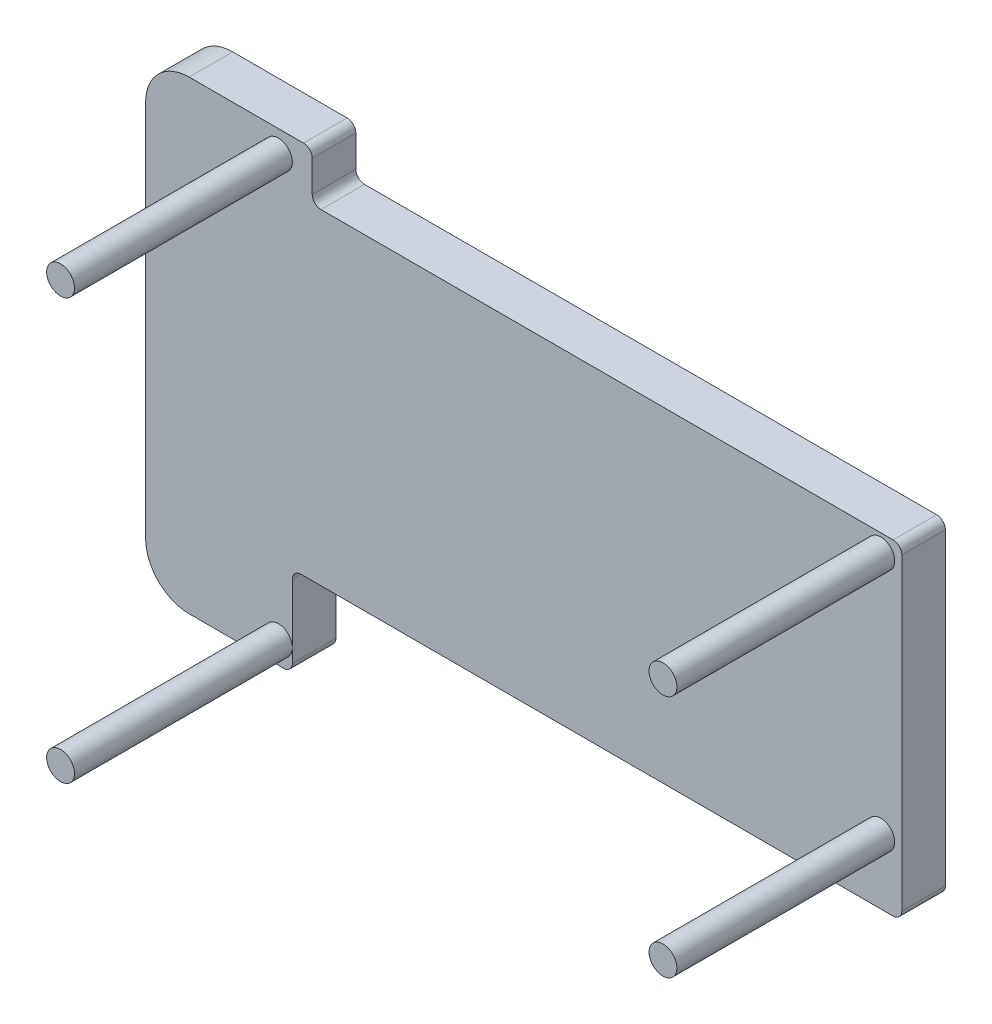
ISO-10303-21;
HEADER;
FILE_DESCRIPTION(('STEP AP214'),'2;1');
FILE_NAME('part.step','',(''),(''),'','','');
FILE_SCHEMA(('AUTOMOTIVE_DESIGN { 1 0 10303 214 1 1 1 1 }'));
ENDSEC;
DATA;
#1=APPLICATION_CONTEXT('core data for automotive mechanical design processes');
#2=APPLICATION_PROTOCOL_DEFINITION('international standard','automotive_design',2000,#1);
#3=PRODUCT_CONTEXT('',#1,'mechanical');
#4=PRODUCT('Part','Part','',(#3));
#5=PRODUCT_RELATED_PRODUCT_CATEGORY('part','',(#4));
#6=PRODUCT_DEFINITION_FORMATION('','',#4);
#7=PRODUCT_DEFINITION_CONTEXT('part definition',#1,'design');
#8=PRODUCT_DEFINITION('design','',#6,#7);
#9=PRODUCT_DEFINITION_SHAPE('','',#8);
#10=(LENGTH_UNIT() NAMED_UNIT(*) SI_UNIT(.MILLI.,.METRE.));
#11=(NAMED_UNIT(*) PLANE_ANGLE_UNIT() SI_UNIT($,.RADIAN.));
#12=(NAMED_UNIT(*) SI_UNIT($,.STERADIAN.) SOLID_ANGLE_UNIT());
#13=UNCERTAINTY_MEASURE_WITH_UNIT(LENGTH_MEASURE(1.E-05),#10,'distance_accuracy_value','');
#14=(GEOMETRIC_REPRESENTATION_CONTEXT(3) GLOBAL_UNCERTAINTY_ASSIGNED_CONTEXT((#13)) GLOBAL_UNIT_ASSIGNED_CONTEXT((#10,
#11,#12)) REPRESENTATION_CONTEXT('',''));
#15=CARTESIAN_POINT('',(0.,0.,0.));
#16=DIRECTION('',(0.,0.,1.));
#17=DIRECTION('',(1.,0.,0.));
#18=AXIS2_PLACEMENT_3D('',#15,#16,#17);
#19=CARTESIAN_POINT('',(-28.1477129898509,-24.13,25.));
#20=DIRECTION('',(0.,0.,-1.));
#21=DIRECTION('',(-1.,0.,0.));
#22=AXIS2_PLACEMENT_3D('',#19,#20,#21);
#23=CYLINDRICAL_SURFACE('',#22,1.6);
#24=CARTESIAN_POINT('',(-28.1477129898509,-24.13,25.));
#25=DIRECTION('',(0.,0.,1.));
#26=DIRECTION('',(1.,0.,0.));
#27=AXIS2_PLACEMENT_3D('',#24,#25,#26);
#28=CIRCLE('',#27,1.6);
#29=CARTESIAN_POINT('',(-26.5477129898509,-24.13,25.));
#30=VERTEX_POINT('',#29);
#31=EDGE_CURVE('E257',#30,#30,#28,.T.);
#32=ORIENTED_EDGE('',*,*,#31,.F.);
#33=EDGE_LOOP('',(#32));
#34=FACE_BOUND('',#33,.T.);
#35=CARTESIAN_POINT('',(-28.1477129898509,-24.13,0.));
#36=DIRECTION('',(0.,0.,1.));
#37=DIRECTION('',(1.,0.,0.));
#38=AXIS2_PLACEMENT_3D('',#35,#36,#37);
#39=CIRCLE('',#38,1.6);
#40=CARTESIAN_POINT('',(-26.5477129898509,-24.13,0.));
#41=VERTEX_POINT('',#40);
#42=EDGE_CURVE('E228',#41,#41,#39,.T.);
#43=ORIENTED_EDGE('',*,*,#42,.T.);
#44=EDGE_LOOP('',(#43));
#45=FACE_BOUND('',#44,.T.);
#46=ADVANCED_FACE('F35',(#34,#45),#23,.T.);
#47=CARTESIAN_POINT('',(-28.1477129898509,-24.13,25.));
#48=DIRECTION('',(0.,0.,1.));
#49=DIRECTION('',(1.,0.,0.));
#50=AXIS2_PLACEMENT_3D('',#47,#48,#49);
#51=PLANE('',#50);
#52=ORIENTED_EDGE('',*,*,#31,.T.);
#53=EDGE_LOOP('',(#52));
#54=FACE_BOUND('',#53,.T.);
#55=ADVANCED_FACE('F366',(#54),#51,.T.);
#56=CARTESIAN_POINT('',(-25.5477129898509,-17.3186177986598,-5.));
#57=DIRECTION('',(0.,0.,1.));
#58=DIRECTION('',(1.,0.,0.));
#59=AXIS2_PLACEMENT_3D('',#56,#57,#58);
#60=CYLINDRICAL_SURFACE('',#59,1.);
#61=CARTESIAN_POINT('',(-25.5477129898509,-17.3186177986598,0.));
#62=DIRECTION('',(0.,0.,-1.));
#63=DIRECTION('',(-1.,0.,0.));
#64=AXIS2_PLACEMENT_3D('',#61,#62,#63);
#65=CIRCLE('',#64,1.);
#66=CARTESIAN_POINT('',(-26.5477129898509,-17.3186177986598,0.));
#67=VERTEX_POINT('',#66);
#68=CARTESIAN_POINT('',(-25.5477129898509,-16.3186177986598,0.));
#69=VERTEX_POINT('',#68);
#70=EDGE_CURVE('E185',#67,#69,#65,.T.);
#71=ORIENTED_EDGE('',*,*,#70,.F.);
#72=DIRECTION('',(0.,0.,1.));
#73=VECTOR('',#72,1.);
#74=CARTESIAN_POINT('',(-26.5477129898509,-17.3186177986598,-5.));
#75=LINE('',#74,#73);
#76=CARTESIAN_POINT('',(-26.5477129898509,-17.3186177986598,-5.));
#77=VERTEX_POINT('',#76);
#78=EDGE_CURVE('E226',#77,#67,#75,.T.);
#79=ORIENTED_EDGE('',*,*,#78,.F.);
#80=CARTESIAN_POINT('',(-25.5477129898509,-17.3186177986598,-5.));
#81=DIRECTION('',(0.,0.,-1.));
#82=DIRECTION('',(-1.,0.,0.));
#83=AXIS2_PLACEMENT_3D('',#80,#81,#82);
#84=CIRCLE('',#83,1.);
#85=CARTESIAN_POINT('',(-25.5477129898509,-16.3186177986598,-5.));
#86=VERTEX_POINT('',#85);
#87=EDGE_CURVE('E225',#77,#86,#84,.T.);
#88=ORIENTED_EDGE('',*,*,#87,.T.);
#89=DIRECTION('',(0.,0.,1.));
#90=VECTOR('',#89,1.);
#91=CARTESIAN_POINT('',(-25.5477129898509,-16.3186177986598,-5.));
#92=LINE('',#91,#90);
#93=EDGE_CURVE('E118',#86,#69,#92,.T.);
#94=ORIENTED_EDGE('',*,*,#93,.T.);
#95=EDGE_LOOP('',(#71,#79,#88,#94));
#96=FACE_BOUND('',#95,.T.);
#97=ADVANCED_FACE('F362',(#96),#60,.F.);
#98=CARTESIAN_POINT('',(-26.5477129898509,-24.13,-5.));
#99=DIRECTION('',(1.,0.,0.));
#100=DIRECTION('',(0.,1.,0.));
#101=AXIS2_PLACEMENT_3D('',#98,#99,#100);
#102=PLANE('',#101);
#103=DIRECTION('',(0.,1.,0.));
#104=VECTOR('',#103,1.);
#105=CARTESIAN_POINT('',(-26.5477129898509,-24.13,0.));
#106=LINE('',#105,#104);
#107=CARTESIAN_POINT('',(-26.5477129898509,-25.67,0.));
#108=VERTEX_POINT('',#107);
#109=EDGE_CURVE('E49',#108,#41,#106,.T.);
#110=ORIENTED_EDGE('',*,*,#109,.F.);
#111=DIRECTION('',(0.,0.,1.));
#112=VECTOR('',#111,1.);
#113=CARTESIAN_POINT('',(-26.5477129898509,-25.67,-5.));
#114=LINE('',#113,#112);
#115=CARTESIAN_POINT('',(-26.5477129898509,-25.67,-5.));
#116=VERTEX_POINT('',#115);
#117=EDGE_CURVE('E168',#116,#108,#114,.T.);
#118=ORIENTED_EDGE('',*,*,#117,.F.);
#119=DIRECTION('',(0.,-1.,0.));
#120=VECTOR('',#119,1.);
#121=CARTESIAN_POINT('',(-26.5477129898509,-24.13,-5.));
#122=LINE('',#121,#120);
#123=EDGE_CURVE('E58',#77,#116,#122,.T.);
#124=ORIENTED_EDGE('',*,*,#123,.F.);
#125=ORIENTED_EDGE('',*,*,#78,.T.);
#126=EDGE_CURVE('E111',#41,#67,#106,.T.);
#127=ORIENTED_EDGE('',*,*,#126,.F.);
#128=EDGE_LOOP('',(#110,#118,#124,#125,#127));
#129=FACE_BOUND('',#128,.T.);
#130=ADVANCED_FACE('F363',(#129),#102,.T.);
#131=CARTESIAN_POINT('',(-27.5477129898509,-25.67,-5.));
#132=DIRECTION('',(0.,0.,1.));
#133=DIRECTION('',(1.,0.,0.));
#134=AXIS2_PLACEMENT_3D('',#131,#132,#133);
#135=CYLINDRICAL_SURFACE('',#134,1.);
#136=CARTESIAN_POINT('',(-27.5477129898509,-25.67,0.));
#137=DIRECTION('',(0.,0.,1.));
#138=DIRECTION('',(1.,0.,0.));
#139=AXIS2_PLACEMENT_3D('',#136,#137,#138);
#140=CIRCLE('',#139,1.);
#141=CARTESIAN_POINT('',(-27.5477129898509,-26.67,0.));
#142=VERTEX_POINT('',#141);
#143=EDGE_CURVE('E165',#142,#108,#140,.T.);
#144=ORIENTED_EDGE('',*,*,#143,.F.);
#145=DIRECTION('',(0.,0.,1.));
#146=VECTOR('',#145,1.);
#147=CARTESIAN_POINT('',(-27.5477129898509,-26.67,-5.));
#148=LINE('',#147,#146);
#149=CARTESIAN_POINT('',(-27.5477129898509,-26.67,-5.));
#150=VERTEX_POINT('',#149);
#151=EDGE_CURVE('E159',#150,#142,#148,.T.);
#152=ORIENTED_EDGE('',*,*,#151,.F.);
#153=CARTESIAN_POINT('',(-27.5477129898509,-25.67,-5.));
#154=DIRECTION('',(0.,0.,1.));
#155=DIRECTION('',(1.,0.,0.));
#156=AXIS2_PLACEMENT_3D('',#153,#154,#155);
#157=CIRCLE('',#156,1.);
#158=EDGE_CURVE('E164',#150,#116,#157,.T.);
#159=ORIENTED_EDGE('',*,*,#158,.T.);
#160=ORIENTED_EDGE('',*,*,#117,.T.);
#161=EDGE_LOOP('',(#144,#152,#159,#160));
#162=FACE_BOUND('',#161,.T.);
#163=ADVANCED_FACE('F161',(#162),#135,.T.);
#164=CARTESIAN_POINT('',(-27.5477129898509,-26.67,-5.));
#165=DIRECTION('',(0.,1.,0.));
#166=DIRECTION('',(0.,0.,1.));
#167=AXIS2_PLACEMENT_3D('',#164,#165,#166);
#168=PLANE('',#167);
#169=DIRECTION('',(-1.,0.,0.));
#170=VECTOR('',#169,1.);
#171=CARTESIAN_POINT('',(-27.5477129898509,-26.67,0.));
#172=LINE('',#171,#170);
#173=CARTESIAN_POINT('',(-38.3877129898509,-26.67,0.));
#174=VERTEX_POINT('',#173);
#175=EDGE_CURVE('E221',#142,#174,#172,.T.);
#176=ORIENTED_EDGE('',*,*,#175,.T.);
#177=DIRECTION('',(0.,0.,1.));
#178=VECTOR('',#177,1.);
#179=CARTESIAN_POINT('',(-38.3877129898509,-26.67,-5.));
#180=LINE('',#179,#178);
#181=CARTESIAN_POINT('',(-38.3877129898509,-26.67,-5.));
#182=VERTEX_POINT('',#181);
#183=EDGE_CURVE('E169',#182,#174,#180,.T.);
#184=ORIENTED_EDGE('',*,*,#183,.F.);
#185=DIRECTION('',(-1.,0.,0.));
#186=VECTOR('',#185,1.);
#187=CARTESIAN_POINT('',(-27.5477129898509,-26.67,-5.));
#188=LINE('',#187,#186);
#189=EDGE_CURVE('E172',#150,#182,#188,.T.);
#190=ORIENTED_EDGE('',*,*,#189,.F.);
#191=ORIENTED_EDGE('',*,*,#151,.T.);
#192=EDGE_LOOP('',(#176,#184,#190,#191));
#193=FACE_BOUND('',#192,.T.);
#194=ADVANCED_FACE('F173',(#193),#168,.F.);
#195=CARTESIAN_POINT('',(-38.3877129898509,-21.67,-5.));
#196=DIRECTION('',(0.,0.,1.));
#197=DIRECTION('',(1.,0.,0.));
#198=AXIS2_PLACEMENT_3D('',#195,#196,#197);
#199=CYLINDRICAL_SURFACE('',#198,5.);
#200=CARTESIAN_POINT('',(-38.3877129898509,-21.67,0.));
#201=DIRECTION('',(0.,0.,-1.));
#202=DIRECTION('',(-1.,0.,0.));
#203=AXIS2_PLACEMENT_3D('',#200,#201,#202);
#204=CIRCLE('',#203,5.);
#205=CARTESIAN_POINT('',(-43.3877129898509,-21.67,0.));
#206=VERTEX_POINT('',#205);
#207=EDGE_CURVE('E219',#174,#206,#204,.T.);
#208=ORIENTED_EDGE('',*,*,#207,.T.);
#209=DIRECTION('',(0.,0.,1.));
#210=VECTOR('',#209,1.);
#211=CARTESIAN_POINT('',(-43.3877129898509,-21.67,-5.));
#212=LINE('',#211,#210);
#213=CARTESIAN_POINT('',(-43.3877129898509,-21.67,-5.));
#214=VERTEX_POINT('',#213);
#215=EDGE_CURVE('E231',#214,#206,#212,.T.);
#216=ORIENTED_EDGE('',*,*,#215,.F.);
#217=CARTESIAN_POINT('',(-38.3877129898509,-21.67,-5.));
#218=DIRECTION('',(0.,0.,-1.));
#219=DIRECTION('',(-1.,0.,0.));
#220=AXIS2_PLACEMENT_3D('',#217,#218,#219);
#221=CIRCLE('',#220,5.);
#222=EDGE_CURVE('E177',#182,#214,#221,.T.);
#223=ORIENTED_EDGE('',*,*,#222,.F.);
#224=ORIENTED_EDGE('',*,*,#183,.T.);
#225=EDGE_LOOP('',(#208,#216,#223,#224));
#226=FACE_BOUND('',#225,.T.);
#227=ADVANCED_FACE('F317',(#226),#199,.T.);
#228=CARTESIAN_POINT('',(-43.3877129898509,-21.67,-5.));
#229=DIRECTION('',(1.,0.,0.));
#230=DIRECTION('',(0.,1.,0.));
#231=AXIS2_PLACEMENT_3D('',#228,#229,#230);
#232=PLANE('',#231);
#233=DIRECTION('',(0.,1.,0.));
#234=VECTOR('',#233,1.);
#235=CARTESIAN_POINT('',(-43.3877129898509,-21.67,0.));
#236=LINE('',#235,#234);
#237=CARTESIAN_POINT('',(-43.3877129898509,21.67,0.));
#238=VERTEX_POINT('',#237);
#239=EDGE_CURVE('E216',#206,#238,#236,.T.);
#240=ORIENTED_EDGE('',*,*,#239,.T.);
#241=DIRECTION('',(0.,0.,1.));
#242=VECTOR('',#241,1.);
#243=CARTESIAN_POINT('',(-43.3877129898509,21.67,-5.));
#244=LINE('',#243,#242);
#245=CARTESIAN_POINT('',(-43.3877129898509,21.67,-5.));
#246=VERTEX_POINT('',#245);
#247=EDGE_CURVE('E234',#246,#238,#244,.T.);
#248=ORIENTED_EDGE('',*,*,#247,.F.);
#249=DIRECTION('',(0.,1.,0.));
#250=VECTOR('',#249,1.);
#251=CARTESIAN_POINT('',(-43.3877129898509,-21.67,-5.));
#252=LINE('',#251,#250);
#253=EDGE_CURVE('E311',#214,#246,#252,.T.);
#254=ORIENTED_EDGE('',*,*,#253,.F.);
#255=ORIENTED_EDGE('',*,*,#215,.T.);
#256=EDGE_LOOP('',(#240,#248,#254,#255));
#257=FACE_BOUND('',#256,.T.);
#258=ADVANCED_FACE('F321',(#257),#232,.F.);
#259=CARTESIAN_POINT('',(-38.3877129898509,21.67,-5.));
#260=DIRECTION('',(0.,0.,1.));
#261=DIRECTION('',(1.,0.,0.));
#262=AXIS2_PLACEMENT_3D('',#259,#260,#261);
#263=CYLINDRICAL_SURFACE('',#262,4.99999999999999);
#264=CARTESIAN_POINT('',(-38.3877129898509,21.67,0.));
#265=DIRECTION('',(0.,0.,1.));
#266=DIRECTION('',(1.,0.,0.));
#267=AXIS2_PLACEMENT_3D('',#264,#265,#266);
#268=CIRCLE('',#267,4.99999999999999);
#269=CARTESIAN_POINT('',(-38.3877129898509,26.67,0.));
#270=VERTEX_POINT('',#269);
#271=EDGE_CURVE('E213',#270,#238,#268,.T.);
#272=ORIENTED_EDGE('',*,*,#271,.F.);
#273=DIRECTION('',(0.,0.,1.));
#274=VECTOR('',#273,1.);
#275=CARTESIAN_POINT('',(-38.3877129898509,26.67,-5.));
#276=LINE('',#275,#274);
#277=CARTESIAN_POINT('',(-38.3877129898509,26.67,-5.));
#278=VERTEX_POINT('',#277);
#279=EDGE_CURVE('E236',#278,#270,#276,.T.);
#280=ORIENTED_EDGE('',*,*,#279,.F.);
#281=CARTESIAN_POINT('',(-38.3877129898509,21.67,-5.));
#282=DIRECTION('',(0.,0.,1.));
#283=DIRECTION('',(1.,0.,0.));
#284=AXIS2_PLACEMENT_3D('',#281,#282,#283);
#285=CIRCLE('',#284,4.99999999999999);
#286=EDGE_CURVE('E308',#278,#246,#285,.T.);
#287=ORIENTED_EDGE('',*,*,#286,.T.);
#288=ORIENTED_EDGE('',*,*,#247,.T.);
#289=EDGE_LOOP('',(#272,#280,#287,#288));
#290=FACE_BOUND('',#289,.T.);
#291=ADVANCED_FACE('F324',(#290),#263,.T.);
#292=CARTESIAN_POINT('',(-25.2666666666667,26.67,-5.));
#293=DIRECTION('',(0.,1.,0.));
#294=DIRECTION('',(0.,0.,1.));
#295=AXIS2_PLACEMENT_3D('',#292,#293,#294);
#296=PLANE('',#295);
#297=DIRECTION('',(-1.,0.,0.));
#298=VECTOR('',#297,1.);
#299=CARTESIAN_POINT('',(-25.2666666666667,26.67,0.));
#300=LINE('',#299,#298);
#301=CARTESIAN_POINT('',(-25.2666666666667,26.67,0.));
#302=VERTEX_POINT('',#301);
#303=EDGE_CURVE('E210',#302,#270,#300,.T.);
#304=ORIENTED_EDGE('',*,*,#303,.F.);
#305=DIRECTION('',(0.,0.,1.));
#306=VECTOR('',#305,1.);
#307=CARTESIAN_POINT('',(-25.2666666666667,26.67,-5.));
#308=LINE('',#307,#306);
#309=CARTESIAN_POINT('',(-25.2666666666667,26.67,-5.));
#310=VERTEX_POINT('',#309);
#311=EDGE_CURVE('E238',#310,#302,#308,.T.);
#312=ORIENTED_EDGE('',*,*,#311,.F.);
#313=DIRECTION('',(-1.,0.,0.));
#314=VECTOR('',#313,1.);
#315=CARTESIAN_POINT('',(-25.2666666666667,26.67,-5.));
#316=LINE('',#315,#314);
#317=EDGE_CURVE('E305',#310,#278,#316,.T.);
#318=ORIENTED_EDGE('',*,*,#317,.T.);
#319=ORIENTED_EDGE('',*,*,#279,.T.);
#320=EDGE_LOOP('',(#304,#312,#318,#319));
#321=FACE_BOUND('',#320,.T.);
#322=ADVANCED_FACE('F329',(#321),#296,.T.);
#323=CARTESIAN_POINT('',(-25.2666666666667,25.67,-5.));
#324=DIRECTION('',(0.,0.,1.));
#325=DIRECTION('',(1.,0.,0.));
#326=AXIS2_PLACEMENT_3D('',#323,#324,#325);
#327=CYLINDRICAL_SURFACE('',#326,1.);
#328=CARTESIAN_POINT('',(-25.2666666666667,25.67,0.));
#329=DIRECTION('',(0.,0.,1.));
#330=DIRECTION('',(1.,0.,0.));
#331=AXIS2_PLACEMENT_3D('',#328,#329,#330);
#332=CIRCLE('',#331,1.);
#333=CARTESIAN_POINT('',(-24.2666666666667,25.67,0.));
#334=VERTEX_POINT('',#333);
#335=EDGE_CURVE('E207',#334,#302,#332,.T.);
#336=ORIENTED_EDGE('',*,*,#335,.F.);
#337=DIRECTION('',(0.,0.,1.));
#338=VECTOR('',#337,1.);
#339=CARTESIAN_POINT('',(-24.2666666666667,25.67,-5.));
#340=LINE('',#339,#338);
#341=CARTESIAN_POINT('',(-24.2666666666667,25.67,-5.));
#342=VERTEX_POINT('',#341);
#343=EDGE_CURVE('E240',#342,#334,#340,.T.);
#344=ORIENTED_EDGE('',*,*,#343,.F.);
#345=CARTESIAN_POINT('',(-25.2666666666667,25.67,-5.));
#346=DIRECTION('',(0.,0.,1.));
#347=DIRECTION('',(1.,0.,0.));
#348=AXIS2_PLACEMENT_3D('',#345,#346,#347);
#349=CIRCLE('',#348,1.);
#350=EDGE_CURVE('E302',#342,#310,#349,.T.);
#351=ORIENTED_EDGE('',*,*,#350,.T.);
#352=ORIENTED_EDGE('',*,*,#311,.T.);
#353=EDGE_LOOP('',(#336,#344,#351,#352));
#354=FACE_BOUND('',#353,.T.);
#355=ADVANCED_FACE('F332',(#354),#327,.T.);
#356=CARTESIAN_POINT('',(-24.2666666666667,25.67,-5.));
#357=DIRECTION('',(-1.,0.,0.));
#358=DIRECTION('',(0.,0.,1.));
#359=AXIS2_PLACEMENT_3D('',#356,#357,#358);
#360=PLANE('',#359);
#361=DIRECTION('',(0.,-1.,0.));
#362=VECTOR('',#361,1.);
#363=CARTESIAN_POINT('',(-24.2666666666667,25.67,0.));
#364=LINE('',#363,#362);
#365=CARTESIAN_POINT('',(-24.2666666666667,22.0666666666667,0.));
#366=VERTEX_POINT('',#365);
#367=EDGE_CURVE('E205',#334,#366,#364,.T.);
#368=ORIENTED_EDGE('',*,*,#367,.T.);
#369=DIRECTION('',(0.,0.,1.));
#370=VECTOR('',#369,1.);
#371=CARTESIAN_POINT('',(-24.2666666666667,22.0666666666667,-5.));
#372=LINE('',#371,#370);
#373=CARTESIAN_POINT('',(-24.2666666666667,22.0666666666667,-5.));
#374=VERTEX_POINT('',#373);
#375=EDGE_CURVE('E242',#374,#366,#372,.T.);
#376=ORIENTED_EDGE('',*,*,#375,.F.);
#377=DIRECTION('',(0.,-1.,0.));
#378=VECTOR('',#377,1.);
#379=CARTESIAN_POINT('',(-24.2666666666667,25.67,-5.));
#380=LINE('',#379,#378);
#381=EDGE_CURVE('E300',#342,#374,#380,.T.);
#382=ORIENTED_EDGE('',*,*,#381,.F.);
#383=ORIENTED_EDGE('',*,*,#343,.T.);
#384=EDGE_LOOP('',(#368,#376,#382,#383));
#385=FACE_BOUND('',#384,.T.);
#386=ADVANCED_FACE('F338',(#385),#360,.F.);
#387=CARTESIAN_POINT('',(-23.2666666666667,22.0666666666667,-5.));
#388=DIRECTION('',(0.,0.,1.));
#389=DIRECTION('',(1.,0.,0.));
#390=AXIS2_PLACEMENT_3D('',#387,#388,#389);
#391=CYLINDRICAL_SURFACE('',#390,1.);
#392=CARTESIAN_POINT('',(-23.2666666666667,22.0666666666667,0.));
#393=DIRECTION('',(0.,0.,1.));
#394=DIRECTION('',(1.,0.,0.));
#395=AXIS2_PLACEMENT_3D('',#392,#393,#394);
#396=CIRCLE('',#395,1.);
#397=CARTESIAN_POINT('',(-23.2666666666667,21.0666666666667,0.));
#398=VERTEX_POINT('',#397);
#399=EDGE_CURVE('E203',#366,#398,#396,.T.);
#400=ORIENTED_EDGE('',*,*,#399,.T.);
#401=DIRECTION('',(0.,0.,1.));
#402=VECTOR('',#401,1.);
#403=CARTESIAN_POINT('',(-23.2666666666667,21.0666666666667,-5.));
#404=LINE('',#403,#402);
#405=CARTESIAN_POINT('',(-23.2666666666667,21.0666666666667,-5.));
#406=VERTEX_POINT('',#405);
#407=EDGE_CURVE('E245',#406,#398,#404,.T.);
#408=ORIENTED_EDGE('',*,*,#407,.F.);
#409=CARTESIAN_POINT('',(-23.2666666666667,22.0666666666667,-5.));
#410=DIRECTION('',(0.,0.,1.));
#411=DIRECTION('',(1.,0.,0.));
#412=AXIS2_PLACEMENT_3D('',#409,#410,#411);
#413=CIRCLE('',#412,1.);
#414=EDGE_CURVE('E298',#374,#406,#413,.T.);
#415=ORIENTED_EDGE('',*,*,#414,.F.);
#416=ORIENTED_EDGE('',*,*,#375,.T.);
#417=EDGE_LOOP('',(#400,#408,#415,#416));
#418=FACE_BOUND('',#417,.T.);
#419=ADVANCED_FACE('F342',(#418),#391,.F.);
#420=CARTESIAN_POINT('',(-23.2666666666667,21.0666666666667,-5.));
#421=DIRECTION('',(0.,-1.,0.));
#422=DIRECTION('',(0.,0.,-1.));
#423=AXIS2_PLACEMENT_3D('',#420,#421,#422);
#424=PLANE('',#423);
#425=DIRECTION('',(1.,0.,0.));
#426=VECTOR('',#425,1.);
#427=CARTESIAN_POINT('',(-23.2666666666667,21.0666666666667,0.));
#428=LINE('',#427,#426);
#429=CARTESIAN_POINT('',(42.3877129898509,21.0666666666667,0.));
#430=VERTEX_POINT('',#429);
#431=EDGE_CURVE('E200',#398,#430,#428,.T.);
#432=ORIENTED_EDGE('',*,*,#431,.T.);
#433=DIRECTION('',(0.,0.,1.));
#434=VECTOR('',#433,1.);
#435=CARTESIAN_POINT('',(42.3877129898509,21.0666666666667,-5.));
#436=LINE('',#435,#434);
#437=CARTESIAN_POINT('',(42.3877129898509,21.0666666666667,-5.));
#438=VERTEX_POINT('',#437);
#439=EDGE_CURVE('E248',#438,#430,#436,.T.);
#440=ORIENTED_EDGE('',*,*,#439,.F.);
#441=DIRECTION('',(1.,0.,0.));
#442=VECTOR('',#441,1.);
#443=CARTESIAN_POINT('',(-23.2666666666667,21.0666666666667,-5.));
#444=LINE('',#443,#442);
#445=EDGE_CURVE('E296',#406,#438,#444,.T.);
#446=ORIENTED_EDGE('',*,*,#445,.F.);
#447=ORIENTED_EDGE('',*,*,#407,.T.);
#448=EDGE_LOOP('',(#432,#440,#446,#447));
#449=FACE_BOUND('',#448,.T.);
#450=ADVANCED_FACE('F347',(#449),#424,.F.);
#451=CARTESIAN_POINT('',(42.3877129898509,20.0666666666667,-5.));
#452=DIRECTION('',(0.,0.,1.));
#453=DIRECTION('',(1.,0.,0.));
#454=AXIS2_PLACEMENT_3D('',#451,#452,#453);
#455=CYLINDRICAL_SURFACE('',#454,1.);
#456=CARTESIAN_POINT('',(42.3877129898509,20.0666666666667,0.));
#457=DIRECTION('',(0.,0.,1.));
#458=DIRECTION('',(1.,0.,0.));
#459=AXIS2_PLACEMENT_3D('',#456,#457,#458);
#460=CIRCLE('',#459,1.);
#461=CARTESIAN_POINT('',(43.3877129898509,20.0666666666667,0.));
#462=VERTEX_POINT('',#461);
#463=EDGE_CURVE('E197',#462,#430,#460,.T.);
#464=ORIENTED_EDGE('',*,*,#463,.F.);
#465=DIRECTION('',(0.,0.,1.));
#466=VECTOR('',#465,1.);
#467=CARTESIAN_POINT('',(43.3877129898509,20.0666666666667,-5.));
#468=LINE('',#467,#466);
#469=CARTESIAN_POINT('',(43.3877129898509,20.0666666666667,-5.));
#470=VERTEX_POINT('',#469);
#471=EDGE_CURVE('E250',#470,#462,#468,.T.);
#472=ORIENTED_EDGE('',*,*,#471,.F.);
#473=CARTESIAN_POINT('',(42.3877129898509,20.0666666666667,-5.));
#474=DIRECTION('',(0.,0.,1.));
#475=DIRECTION('',(1.,0.,0.));
#476=AXIS2_PLACEMENT_3D('',#473,#474,#475);
#477=CIRCLE('',#476,1.);
#478=EDGE_CURVE('E293',#470,#438,#477,.T.);
#479=ORIENTED_EDGE('',*,*,#478,.T.);
#480=ORIENTED_EDGE('',*,*,#439,.T.);
#481=EDGE_LOOP('',(#464,#472,#479,#480));
#482=FACE_BOUND('',#481,.T.);
#483=ADVANCED_FACE('F384',(#482),#455,.T.);
#484=CARTESIAN_POINT('',(43.3877129898509,-15.3186177986598,-5.));
#485=DIRECTION('',(1.,0.,0.));
#486=DIRECTION('',(0.,1.,0.));
#487=AXIS2_PLACEMENT_3D('',#484,#485,#486);
#488=PLANE('',#487);
#489=DIRECTION('',(0.,1.,0.));
#490=VECTOR('',#489,1.);
#491=CARTESIAN_POINT('',(43.3877129898509,-15.3186177986598,0.));
#492=LINE('',#491,#490);
#493=CARTESIAN_POINT('',(43.3877129898509,-15.3186177986598,0.));
#494=VERTEX_POINT('',#493);
#495=EDGE_CURVE('E194',#494,#462,#492,.T.);
#496=ORIENTED_EDGE('',*,*,#495,.F.);
#497=DIRECTION('',(0.,0.,1.));
#498=VECTOR('',#497,1.);
#499=CARTESIAN_POINT('',(43.3877129898509,-15.3186177986598,-5.));
#500=LINE('',#499,#498);
#501=CARTESIAN_POINT('',(43.3877129898509,-15.3186177986598,-5.));
#502=VERTEX_POINT('',#501);
#503=EDGE_CURVE('E252',#502,#494,#500,.T.);
#504=ORIENTED_EDGE('',*,*,#503,.F.);
#505=DIRECTION('',(0.,1.,0.));
#506=VECTOR('',#505,1.);
#507=CARTESIAN_POINT('',(43.3877129898509,-15.3186177986598,-5.));
#508=LINE('',#507,#506);
#509=EDGE_CURVE('E290',#502,#470,#508,.T.);
#510=ORIENTED_EDGE('',*,*,#509,.T.);
#511=ORIENTED_EDGE('',*,*,#471,.T.);
#512=EDGE_LOOP('',(#496,#504,#510,#511));
#513=FACE_BOUND('',#512,.T.);
#514=ADVANCED_FACE('F354',(#513),#488,.T.);
#515=CARTESIAN_POINT('',(42.3877129898509,-15.3186177986598,-5.));
#516=DIRECTION('',(0.,0.,1.));
#517=DIRECTION('',(1.,0.,0.));
#518=AXIS2_PLACEMENT_3D('',#515,#516,#517);
#519=CYLINDRICAL_SURFACE('',#518,1.);
#520=CARTESIAN_POINT('',(42.3877129898509,-15.3186177986598,0.));
#521=DIRECTION('',(0.,0.,1.));
#522=DIRECTION('',(1.,0.,0.));
#523=AXIS2_PLACEMENT_3D('',#520,#521,#522);
#524=CIRCLE('',#523,1.);
#525=CARTESIAN_POINT('',(42.3877129898509,-16.3186177986598,0.));
#526=VERTEX_POINT('',#525);
#527=EDGE_CURVE('E191',#526,#494,#524,.T.);
#528=ORIENTED_EDGE('',*,*,#527,.F.);
#529=DIRECTION('',(0.,0.,1.));
#530=VECTOR('',#529,1.);
#531=CARTESIAN_POINT('',(42.3877129898509,-16.3186177986598,-5.));
#532=LINE('',#531,#530);
#533=CARTESIAN_POINT('',(42.3877129898509,-16.3186177986598,-5.));
#534=VERTEX_POINT('',#533);
#535=EDGE_CURVE('E254',#534,#526,#532,.T.);
#536=ORIENTED_EDGE('',*,*,#535,.F.);
#537=CARTESIAN_POINT('',(42.3877129898509,-15.3186177986598,-5.));
#538=DIRECTION('',(0.,0.,1.));
#539=DIRECTION('',(1.,0.,0.));
#540=AXIS2_PLACEMENT_3D('',#537,#538,#539);
#541=CIRCLE('',#540,1.);
#542=EDGE_CURVE('E287',#534,#502,#541,.T.);
#543=ORIENTED_EDGE('',*,*,#542,.T.);
#544=ORIENTED_EDGE('',*,*,#503,.T.);
#545=EDGE_LOOP('',(#528,#536,#543,#544));
#546=FACE_BOUND('',#545,.T.);
#547=ADVANCED_FACE('F358',(#546),#519,.T.);
#548=CARTESIAN_POINT('',(-25.5477129898509,-16.3186177986598,-5.));
#549=DIRECTION('',(0.,-1.,0.));
#550=DIRECTION('',(0.,0.,-1.));
#551=AXIS2_PLACEMENT_3D('',#548,#549,#550);
#552=PLANE('',#551);
#553=DIRECTION('',(1.,0.,0.));
#554=VECTOR('',#553,1.);
#555=CARTESIAN_POINT('',(-25.5477129898509,-16.3186177986598,0.));
#556=LINE('',#555,#554);
#557=EDGE_CURVE('E187',#69,#526,#556,.T.);
#558=ORIENTED_EDGE('',*,*,#557,.F.);
#559=ORIENTED_EDGE('',*,*,#93,.F.);
#560=DIRECTION('',(1.,0.,0.));
#561=VECTOR('',#560,1.);
#562=CARTESIAN_POINT('',(-25.5477129898509,-16.3186177986598,-5.));
#563=LINE('',#562,#561);
#564=EDGE_CURVE('E285',#86,#534,#563,.T.);
#565=ORIENTED_EDGE('',*,*,#564,.T.);
#566=ORIENTED_EDGE('',*,*,#535,.T.);
#567=EDGE_LOOP('',(#558,#559,#565,#566));
#568=FACE_BOUND('',#567,.T.);
#569=ADVANCED_FACE('F359',(#568),#552,.T.);
#570=CARTESIAN_POINT('',(-25.5477129898509,-17.3186177986598,-5.));
#571=DIRECTION('',(0.,0.,-1.));
#572=DIRECTION('',(-1.,0.,0.));
#573=AXIS2_PLACEMENT_3D('',#570,#571,#572);
#574=PLANE('',#573);
#575=ORIENTED_EDGE('',*,*,#87,.F.);
#576=ORIENTED_EDGE('',*,*,#123,.T.);
#577=ORIENTED_EDGE('',*,*,#158,.F.);
#578=ORIENTED_EDGE('',*,*,#189,.T.);
#579=ORIENTED_EDGE('',*,*,#222,.T.);
#580=ORIENTED_EDGE('',*,*,#253,.T.);
#581=ORIENTED_EDGE('',*,*,#286,.F.);
#582=ORIENTED_EDGE('',*,*,#317,.F.);
#583=ORIENTED_EDGE('',*,*,#350,.F.);
#584=ORIENTED_EDGE('',*,*,#381,.T.);
#585=ORIENTED_EDGE('',*,*,#414,.T.);
#586=ORIENTED_EDGE('',*,*,#445,.T.);
#587=ORIENTED_EDGE('',*,*,#478,.F.);
#588=ORIENTED_EDGE('',*,*,#509,.F.);
#589=ORIENTED_EDGE('',*,*,#542,.F.);
#590=ORIENTED_EDGE('',*,*,#564,.F.);
#591=EDGE_LOOP('',(#575,#576,#577,#578,#579,#580,#581,#582,#583,#584,#585,#586,#587,#588,#589,#590));
#592=FACE_BOUND('',#591,.T.);
#593=ADVANCED_FACE('F180',(#592),#574,.T.);
#594=CARTESIAN_POINT('',(-25.5477129898509,-17.3186177986598,0.));
#595=DIRECTION('',(0.,0.,-1.));
#596=DIRECTION('',(-1.,0.,0.));
#597=AXIS2_PLACEMENT_3D('',#594,#595,#596);
#598=PLANE('',#597);
#599=CARTESIAN_POINT('',(40.9777777777778,19.05,0.));
#600=DIRECTION('',(0.,0.,-1.));
#601=DIRECTION('',(-1.,0.,0.));
#602=AXIS2_PLACEMENT_3D('',#599,#600,#601);
#603=CIRCLE('',#602,1.6);
#604=CARTESIAN_POINT('',(39.3777777777778,19.05,0.));
#605=VERTEX_POINT('',#604);
#606=EDGE_CURVE('E11',#605,#605,#603,.F.);
#607=ORIENTED_EDGE('',*,*,#606,.F.);
#608=EDGE_LOOP('',(#607));
#609=FACE_BOUND('',#608,.T.);
#610=CARTESIAN_POINT('',(40.9777777777778,-8.89,0.));
#611=DIRECTION('',(0.,0.,-1.));
#612=DIRECTION('',(-1.,0.,0.));
#613=AXIS2_PLACEMENT_3D('',#610,#611,#612);
#614=CIRCLE('',#613,1.6);
#615=CARTESIAN_POINT('',(39.3777777777778,-8.89,0.));
#616=VERTEX_POINT('',#615);
#617=EDGE_CURVE('E42',#616,#616,#614,.F.);
#618=ORIENTED_EDGE('',*,*,#617,.F.);
#619=EDGE_LOOP('',(#618));
#620=FACE_BOUND('',#619,.T.);
#621=CARTESIAN_POINT('',(-28.1477129898509,24.13,0.));
#622=DIRECTION('',(0.,0.,-1.));
#623=DIRECTION('',(-1.,0.,0.));
#624=AXIS2_PLACEMENT_3D('',#621,#622,#623);
#625=CIRCLE('',#624,1.6);
#626=CARTESIAN_POINT('',(-29.7477129898509,24.13,0.));
#627=VERTEX_POINT('',#626);
#628=EDGE_CURVE('E188',#627,#627,#625,.T.);
#629=ORIENTED_EDGE('',*,*,#628,.T.);
#630=EDGE_LOOP('',(#629));
#631=FACE_BOUND('',#630,.T.);
#632=ORIENTED_EDGE('',*,*,#109,.T.);
#633=ORIENTED_EDGE('',*,*,#42,.F.);
#634=ORIENTED_EDGE('',*,*,#126,.T.);
#635=ORIENTED_EDGE('',*,*,#70,.T.);
#636=ORIENTED_EDGE('',*,*,#557,.T.);
#637=ORIENTED_EDGE('',*,*,#527,.T.);
#638=ORIENTED_EDGE('',*,*,#495,.T.);
#639=ORIENTED_EDGE('',*,*,#463,.T.);
#640=ORIENTED_EDGE('',*,*,#431,.F.);
#641=ORIENTED_EDGE('',*,*,#399,.F.);
#642=ORIENTED_EDGE('',*,*,#367,.F.);
#643=ORIENTED_EDGE('',*,*,#335,.T.);
#644=ORIENTED_EDGE('',*,*,#303,.T.);
#645=ORIENTED_EDGE('',*,*,#271,.T.);
#646=ORIENTED_EDGE('',*,*,#239,.F.);
#647=ORIENTED_EDGE('',*,*,#207,.F.);
#648=ORIENTED_EDGE('',*,*,#175,.F.);
#649=ORIENTED_EDGE('',*,*,#143,.T.);
#650=EDGE_LOOP('',(#632,#633,#634,#635,#636,#637,#638,#639,#640,#641,#642,#643,#644,#645,#646,
#647,#648,#649));
#651=FACE_BOUND('',#650,.T.);
#652=ADVANCED_FACE('F266',(#609,#620,#631,#651),#598,.F.);
#653=CARTESIAN_POINT('',(-28.1477129898509,24.13,25.));
#654=DIRECTION('',(0.,0.,-1.));
#655=DIRECTION('',(-1.,0.,0.));
#656=AXIS2_PLACEMENT_3D('',#653,#654,#655);
#657=CYLINDRICAL_SURFACE('',#656,1.6);
#658=CARTESIAN_POINT('',(-28.1477129898509,24.13,25.));
#659=DIRECTION('',(0.,0.,-1.));
#660=DIRECTION('',(-1.,0.,0.));
#661=AXIS2_PLACEMENT_3D('',#658,#659,#660);
#662=CIRCLE('',#661,1.6);
#663=CARTESIAN_POINT('',(-29.7477129898509,24.13,25.));
#664=VERTEX_POINT('',#663);
#665=EDGE_CURVE('E275',#664,#664,#662,.T.);
#666=ORIENTED_EDGE('',*,*,#665,.T.);
#667=EDGE_LOOP('',(#666));
#668=FACE_BOUND('',#667,.T.);
#669=ORIENTED_EDGE('',*,*,#628,.F.);
#670=EDGE_LOOP('',(#669));
#671=FACE_BOUND('',#670,.T.);
#672=ADVANCED_FACE('F269',(#668,#671),#657,.T.);
#673=CARTESIAN_POINT('',(-28.1477129898509,24.13,25.));
#674=DIRECTION('',(0.,0.,-1.));
#675=DIRECTION('',(-1.,0.,0.));
#676=AXIS2_PLACEMENT_3D('',#673,#674,#675);
#677=PLANE('',#676);
#678=ORIENTED_EDGE('',*,*,#665,.F.);
#679=EDGE_LOOP('',(#678));
#680=FACE_BOUND('',#679,.T.);
#681=ADVANCED_FACE('F411',(#680),#677,.F.);
#682=CARTESIAN_POINT('',(40.9777777777778,-8.89,25.));
#683=DIRECTION('',(0.,0.,-1.));
#684=DIRECTION('',(-1.,0.,0.));
#685=AXIS2_PLACEMENT_3D('',#682,#683,#684);
#686=CYLINDRICAL_SURFACE('',#685,1.6);
#687=CARTESIAN_POINT('',(40.9777777777778,-8.89,25.));
#688=DIRECTION('',(0.,0.,1.));
#689=DIRECTION('',(1.,0.,0.));
#690=AXIS2_PLACEMENT_3D('',#687,#688,#689);
#691=CIRCLE('',#690,1.6);
#692=CARTESIAN_POINT('',(42.5777777777778,-8.89,25.));
#693=VERTEX_POINT('',#692);
#694=EDGE_CURVE('E278',#693,#693,#691,.T.);
#695=ORIENTED_EDGE('',*,*,#694,.F.);
#696=EDGE_LOOP('',(#695));
#697=FACE_BOUND('',#696,.T.);
#698=ORIENTED_EDGE('',*,*,#617,.T.);
#699=EDGE_LOOP('',(#698));
#700=FACE_BOUND('',#699,.T.);
#701=ADVANCED_FACE('F264',(#697,#700),#686,.T.);
#702=CARTESIAN_POINT('',(40.9777777777778,-8.89,25.));
#703=DIRECTION('',(0.,0.,1.));
#704=DIRECTION('',(1.,0.,0.));
#705=AXIS2_PLACEMENT_3D('',#702,#703,#704);
#706=PLANE('',#705);
#707=ORIENTED_EDGE('',*,*,#694,.T.);
#708=EDGE_LOOP('',(#707));
#709=FACE_BOUND('',#708,.T.);
#710=ADVANCED_FACE('F418',(#709),#706,.T.);
#711=CARTESIAN_POINT('',(40.9777777777778,19.05,25.));
#712=DIRECTION('',(0.,0.,-1.));
#713=DIRECTION('',(-1.,0.,0.));
#714=AXIS2_PLACEMENT_3D('',#711,#712,#713);
#715=CYLINDRICAL_SURFACE('',#714,1.6);
#716=CARTESIAN_POINT('',(40.9777777777778,19.05,25.));
#717=DIRECTION('',(0.,0.,1.));
#718=DIRECTION('',(1.,0.,0.));
#719=AXIS2_PLACEMENT_3D('',#716,#717,#718);
#720=CIRCLE('',#719,1.6);
#721=CARTESIAN_POINT('',(42.5777777777778,19.05,25.));
#722=VERTEX_POINT('',#721);
#723=EDGE_CURVE('E437',#722,#722,#720,.T.);
#724=ORIENTED_EDGE('',*,*,#723,.F.);
#725=EDGE_LOOP('',(#724));
#726=FACE_BOUND('',#725,.T.);
#727=ORIENTED_EDGE('',*,*,#606,.T.);
#728=EDGE_LOOP('',(#727));
#729=FACE_BOUND('',#728,.T.);
#730=ADVANCED_FACE('F421',(#726,#729),#715,.T.);
#731=CARTESIAN_POINT('',(40.9777777777778,19.05,25.));
#732=DIRECTION('',(0.,0.,1.));
#733=DIRECTION('',(1.,0.,0.));
#734=AXIS2_PLACEMENT_3D('',#731,#732,#733);
#735=PLANE('',#734);
#736=ORIENTED_EDGE('',*,*,#723,.T.);
#737=EDGE_LOOP('',(#736));
#738=FACE_BOUND('',#737,.T.);
#739=ADVANCED_FACE('F426',(#738),#735,.T.);
#740=CLOSED_SHELL('',(#46,#55,#97,#130,#163,#194,#227,#258,#291,#322,#355,#386,#419,#450,#483,
#514,#547,#569,#593,#652,#672,#681,#701,#710,#730,#739));
#741=MANIFOLD_SOLID_BREP('B2',#740);
#742=ADVANCED_BREP_SHAPE_REPRESENTATION('',(#18,#741),#14);
#743=SHAPE_DEFINITION_REPRESENTATION(#9,#742);
ENDSEC;
END-ISO-10303-21;
